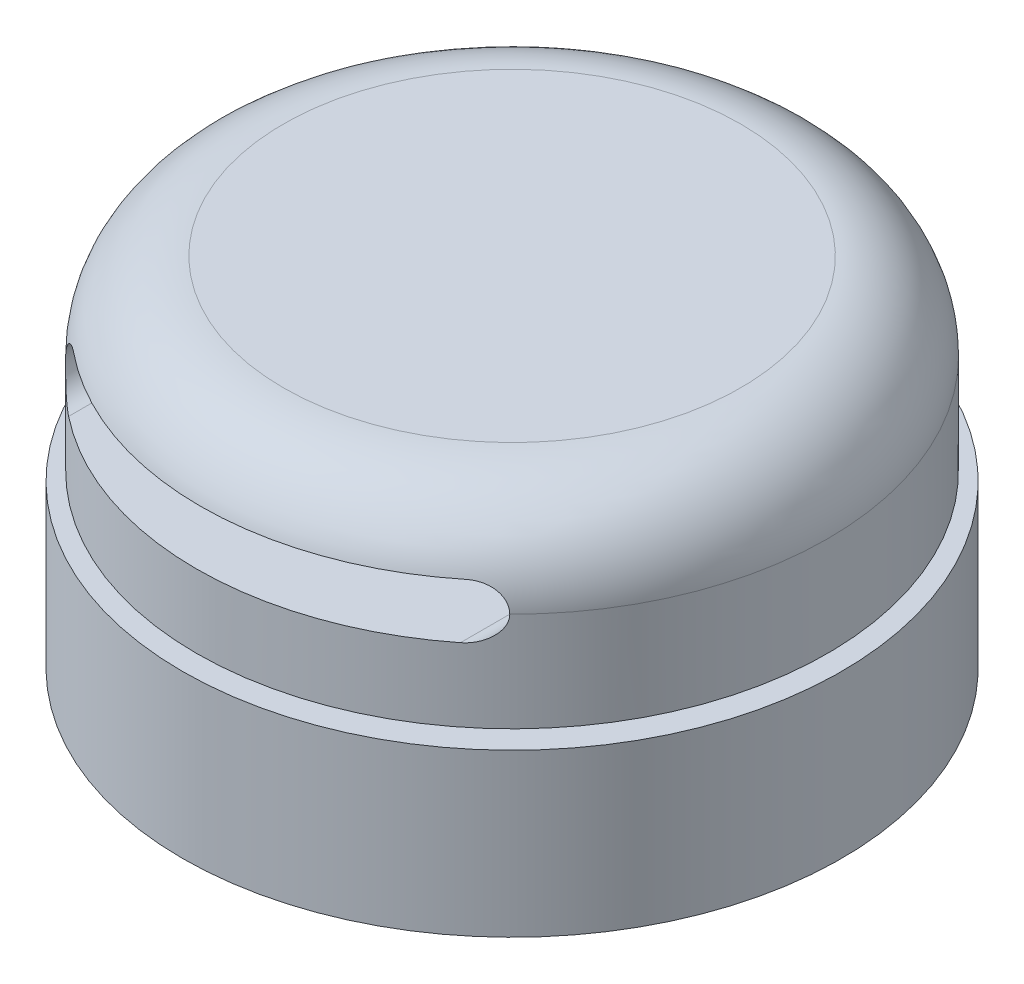
ISO-10303-21;
HEADER;
FILE_DESCRIPTION(('STEP AP214'),'2;1');
FILE_NAME('part.step','',(''),(''),'','','');
FILE_SCHEMA(('AUTOMOTIVE_DESIGN { 1 0 10303 214 1 1 1 1 }'));
ENDSEC;
DATA;
#1=APPLICATION_CONTEXT('core data for automotive mechanical design processes');
#2=APPLICATION_PROTOCOL_DEFINITION('international standard','automotive_design',2000,#1);
#3=PRODUCT_CONTEXT('',#1,'mechanical');
#4=PRODUCT('Part','Part','',(#3));
#5=PRODUCT_RELATED_PRODUCT_CATEGORY('part','',(#4));
#6=PRODUCT_DEFINITION_FORMATION('','',#4);
#7=PRODUCT_DEFINITION_CONTEXT('part definition',#1,'design');
#8=PRODUCT_DEFINITION('design','',#6,#7);
#9=PRODUCT_DEFINITION_SHAPE('','',#8);
#10=(LENGTH_UNIT() NAMED_UNIT(*) SI_UNIT(.MILLI.,.METRE.));
#11=(NAMED_UNIT(*) PLANE_ANGLE_UNIT() SI_UNIT($,.RADIAN.));
#12=(NAMED_UNIT(*) SI_UNIT($,.STERADIAN.) SOLID_ANGLE_UNIT());
#13=UNCERTAINTY_MEASURE_WITH_UNIT(LENGTH_MEASURE(1.E-05),#10,'distance_accuracy_value','');
#14=(GEOMETRIC_REPRESENTATION_CONTEXT(3) GLOBAL_UNCERTAINTY_ASSIGNED_CONTEXT((#13)) GLOBAL_UNIT_ASSIGNED_CONTEXT((#10,
#11,#12)) REPRESENTATION_CONTEXT('',''));
#15=CARTESIAN_POINT('',(0.,0.,0.));
#16=DIRECTION('',(0.,0.,1.));
#17=DIRECTION('',(1.,0.,0.));
#18=AXIS2_PLACEMENT_3D('',#15,#16,#17);
#19=CARTESIAN_POINT('',(0.,49.4448302035958,0.));
#20=DIRECTION('',(0.,1.,0.));
#21=DIRECTION('',(0.,0.,1.));
#22=AXIS2_PLACEMENT_3D('',#19,#20,#21);
#23=CYLINDRICAL_SURFACE('',#22,36.25);
#24=CARTESIAN_POINT('',(0.,19.6,0.));
#25=DIRECTION('',(0.,1.,0.));
#26=DIRECTION('',(0.,0.,1.));
#27=AXIS2_PLACEMENT_3D('',#24,#25,#26);
#28=CIRCLE('',#27,36.25);
#29=CARTESIAN_POINT('',(0.,19.6,36.25));
#30=VERTEX_POINT('',#29);
#31=EDGE_CURVE('E231',#30,#30,#28,.T.);
#32=ORIENTED_EDGE('',*,*,#31,.T.);
#33=EDGE_LOOP('',(#32));
#34=FACE_BOUND('',#33,.T.);
#35=CARTESIAN_POINT('',(0.,28.,0.));
#36=DIRECTION('',(0.,1.,0.));
#37=DIRECTION('',(-1.,0.,0.));
#38=AXIS2_PLACEMENT_3D('',#35,#36,#37);
#39=CIRCLE('',#38,36.25);
#40=CARTESIAN_POINT('',(22.5,28.,28.4220425022552));
#41=VERTEX_POINT('',#40);
#42=CARTESIAN_POINT('',(-22.5,28.,28.4220425022552));
#43=VERTEX_POINT('',#42);
#44=EDGE_CURVE('E11',#41,#43,#39,.F.);
#45=ORIENTED_EDGE('',*,*,#44,.T.);
#46=CARTESIAN_POINT('',(-22.5,28.,28.4220425022552));
#47=CARTESIAN_POINT('',(-22.5991272563362,28.0000112773811,28.3435762432978));
#48=CARTESIAN_POINT('',(-22.697827445781,28.0049132027138,28.2645912354259));
#49=CARTESIAN_POINT('',(-22.8938268930098,28.0243292954554,28.1060665100261));
#50=CARTESIAN_POINT('',(-22.9911261678836,28.0388433455037,28.0265267992827));
#51=CARTESIAN_POINT('',(-23.1846889628995,28.0774962676684,27.8666221445694));
#52=CARTESIAN_POINT('',(-23.2809340287388,28.1017247245251,27.7862564999019));
#53=CARTESIAN_POINT('',(-23.4709004230929,28.1597148240583,27.6259801937129));
#54=CARTESIAN_POINT('',(-23.5646216022771,28.1934770294658,27.5460695593325));
#55=CARTESIAN_POINT('',(-23.7574449798062,28.2740651726963,27.3799910318328));
#56=CARTESIAN_POINT('',(-23.8562543656633,28.3218040796117,27.2939200000065));
#57=CARTESIAN_POINT('',(-24.0493756344703,28.4286898186278,27.1239136057668));
#58=CARTESIAN_POINT('',(-24.1436863472653,28.4878395988589,27.0399788016296));
#59=CARTESIAN_POINT('',(-24.4179165026153,28.682320664838,26.7934214203328));
#60=CARTESIAN_POINT('',(-24.5901994018636,28.8351170492248,26.6351237337365));
#61=CARTESIAN_POINT('',(-24.8400139175762,29.1173885999269,26.4017593826387));
#62=CARTESIAN_POINT('',(-24.9277800711594,29.2315148636311,26.3188293455367));
#63=CARTESIAN_POINT('',(-25.0888665637583,29.4770938268026,26.1653116852357));
#64=CARTESIAN_POINT('',(-25.1622063713028,29.6085227704048,26.0947074429153));
#65=CARTESIAN_POINT('',(-25.2785290658651,29.8618145127486,25.981990342818));
#66=CARTESIAN_POINT('',(-25.324615937038,29.9809726603497,25.9370244790008));
#67=CARTESIAN_POINT('',(-25.4019013701025,30.2282175028122,25.861338833099));
#68=CARTESIAN_POINT('',(-25.4331323303266,30.3562840636697,25.83058805439));
#69=CARTESIAN_POINT('',(-25.4703815935338,30.5709626175445,25.7938479121685));
#70=CARTESIAN_POINT('',(-25.4814290604384,30.6558982250987,25.7829296057569));
#71=CARTESIAN_POINT('',(-25.4962634956304,30.8271956361515,25.7682572023124));
#72=CARTESIAN_POINT('',(-25.500034515711,30.9135601548995,25.7645188420633));
#73=CARTESIAN_POINT('',(-25.5,31.,25.764558990986));
#74=B_SPLINE_CURVE_WITH_KNOTS('',3,(#46,#47,#48,#49,#50,#51,#52,#53,#54,#55,#56,#57,#58,#59,#60,
#61,#62,#63,#64,#65,#66,#67,#68,#69,#70,#71,#72,#73),.UNSPECIFIED.,.F.,.F.,(4,2,2,2,2,2,2,2,2,2,
2,2,2,4),(0.,0.379158835135438,0.758313040962934,1.14104726612169,1.52380408695473,
1.94160001571141,2.35950403176349,3.19094804393893,3.68788832983314,4.18415331723883,
4.58891185558326,4.99278358764909,5.25124078062053,5.5102638084924),.UNSPECIFIED.);
#75=CARTESIAN_POINT('',(-25.5,31.,25.764558990986));
#76=VERTEX_POINT('',#75);
#77=EDGE_CURVE('E103',#43,#76,#74,.T.);
#78=ORIENTED_EDGE('',*,*,#77,.T.);
#79=CARTESIAN_POINT('',(0.,31.,0.));
#80=DIRECTION('',(0.,1.,0.));
#81=DIRECTION('',(0.,0.,1.));
#82=AXIS2_PLACEMENT_3D('',#79,#80,#81);
#83=CIRCLE('',#82,36.25);
#84=CARTESIAN_POINT('',(25.5,31.,25.764558990986));
#85=VERTEX_POINT('',#84);
#86=EDGE_CURVE('E236',#76,#85,#83,.F.);
#87=ORIENTED_EDGE('',*,*,#86,.T.);
#88=CARTESIAN_POINT('',(25.5,31.,25.764558990986));
#89=CARTESIAN_POINT('',(25.5000172713834,30.9318596471252,25.764539383198));
#90=CARTESIAN_POINT('',(25.4976790664596,30.8637337547345,25.766856042954));
#91=CARTESIAN_POINT('',(25.4884254085944,30.7281568662356,25.7760110725714));
#92=CARTESIAN_POINT('',(25.4815139236905,30.6607053364684,25.7828455225362));
#93=CARTESIAN_POINT('',(25.4633287036546,30.5276011333976,25.8008050837608));
#94=CARTESIAN_POINT('',(25.4520945502418,30.4619377652177,25.8118912599647));
#95=CARTESIAN_POINT('',(25.4254980141944,30.3322821351218,25.8380901036482));
#96=CARTESIAN_POINT('',(25.410134954237,30.2682901492777,25.853203431755));
#97=CARTESIAN_POINT('',(25.3583665023379,30.0798780468224,25.9040167571863));
#98=CARTESIAN_POINT('',(25.3162022237244,29.9584633816698,25.9452693626718));
#99=CARTESIAN_POINT('',(25.2189186269762,29.7258428632825,26.0398396648158));
#100=CARTESIAN_POINT('',(25.1637676843775,29.6146628671488,26.0931868014722));
#101=CARTESIAN_POINT('',(25.0171152840386,29.3586033689158,26.2339590258645));
#102=CARTESIAN_POINT('',(24.9201320793327,29.2195156501317,26.3262254428044));
#103=CARTESIAN_POINT('',(24.7100476611945,28.9645393883648,26.5235168401664));
#104=CARTESIAN_POINT('',(24.5969152011891,28.8486968921005,26.6285664948573));
#105=CARTESIAN_POINT('',(24.3206096512403,28.6064685409797,26.8815100554821));
#106=CARTESIAN_POINT('',(24.1529404535271,28.4883761275267,27.0324312218732));
#107=CARTESIAN_POINT('',(23.8026188944664,28.2900657730165,27.3414074125816));
#108=CARTESIAN_POINT('',(23.6199559788888,28.2098747841866,27.49946742619));
#109=CARTESIAN_POINT('',(23.2816293944573,28.0992960932102,27.7860971869189));
#110=CARTESIAN_POINT('',(23.1278140894917,28.062178052847,27.9142852426257));
#111=CARTESIAN_POINT('',(22.8941036352007,28.0249576716345,28.1057403630476));
#112=CARTESIAN_POINT('',(22.815843108061,28.0156272855841,28.1693093350365));
#113=CARTESIAN_POINT('',(22.6584839036153,28.0031509425896,28.2960391792622));
#114=CARTESIAN_POINT('',(22.5793850988749,28.0000059399043,28.3591999870311));
#115=CARTESIAN_POINT('',(22.5,28.,28.4220425022552));
#116=B_SPLINE_CURVE_WITH_KNOTS('',3,(#88,#89,#90,#91,#92,#93,#94,#95,#96,#97,#98,#99,#100,#101,
#102,#103,#104,#105,#106,#107,#108,#109,#110,#111,#112,#113,#114,#115),.UNSPECIFIED.,.F.,.F.,(4,
2,2,2,2,2,2,2,2,2,2,2,2,4),(0.,0.204318121551815,0.408459197149967,0.610773849385636,
0.813121710436548,1.21613155896967,1.62013313509266,2.19604903416862,2.77309474745016,
3.53301614365127,4.29347712043337,4.90281325968593,5.20641055033071,5.51005467521557),.UNSPECIFIED.);
#117=EDGE_CURVE('E105',#85,#41,#116,.T.);
#118=ORIENTED_EDGE('',*,*,#117,.T.);
#119=EDGE_LOOP('',(#45,#78,#87,#118));
#120=FACE_BOUND('',#119,.T.);
#121=ADVANCED_FACE('F39',(#34,#120),#23,.T.);
#122=CARTESIAN_POINT('',(0.,31.,0.));
#123=DIRECTION('',(0.,1.,0.));
#124=DIRECTION('',(0.,0.,1.));
#125=AXIS2_PLACEMENT_3D('',#122,#123,#124);
#126=TOROIDAL_SURFACE('',#125,26.25,10.);
#127=CARTESIAN_POINT('',(0.,41.,0.));
#128=DIRECTION('',(0.,1.,0.));
#129=DIRECTION('',(0.,0.,1.));
#130=AXIS2_PLACEMENT_3D('',#127,#128,#129);
#131=CIRCLE('',#130,26.25);
#132=CARTESIAN_POINT('',(0.,41.,26.25));
#133=VERTEX_POINT('',#132);
#134=EDGE_CURVE('E237',#133,#133,#131,.T.);
#135=ORIENTED_EDGE('',*,*,#134,.F.);
#136=EDGE_LOOP('',(#135));
#137=FACE_BOUND('',#136,.T.);
#138=ORIENTED_EDGE('',*,*,#86,.F.);
#139=CARTESIAN_POINT('',(-25.4999999933333,30.9998,25.7645589947703));
#140=CARTESIAN_POINT('',(-25.5000175110376,31.0755162061052,25.764553151556));
#141=CARTESIAN_POINT('',(-25.4971438987939,31.1512267279592,25.7661803309954));
#142=CARTESIAN_POINT('',(-25.4857092251534,31.3020596128595,25.7726768042864));
#143=CARTESIAN_POINT('',(-25.4771495092813,31.3771821107982,25.777545331126));
#144=CARTESIAN_POINT('',(-25.4544760193107,31.5260446816213,25.7904785352098));
#145=CARTESIAN_POINT('',(-25.4403812526578,31.5997885901689,25.7985322750519));
#146=CARTESIAN_POINT('',(-25.4068322496699,31.7456088450129,25.8177820040526));
#147=CARTESIAN_POINT('',(-25.3873778964153,31.8176851548934,25.828978061761));
#148=CARTESIAN_POINT('',(-25.3213253934495,32.0305982767729,25.8671860298296));
#149=CARTESIAN_POINT('',(-25.2670069476309,32.1683173580336,25.8988349788316));
#150=CARTESIAN_POINT('',(-25.1403773293489,32.4317202061442,25.9737424124763));
#151=CARTESIAN_POINT('',(-25.0680574807422,32.5573981289426,26.0170064960625));
#152=CARTESIAN_POINT('',(-24.9055089276521,32.798740258839,26.1160044664621));
#153=CARTESIAN_POINT('',(-24.8147106343673,32.9138526738924,26.1721449139143));
#154=CARTESIAN_POINT('',(-24.6206949419134,33.1268375386765,26.2945887823756));
#155=CARTESIAN_POINT('',(-24.5174736939047,33.2247046222539,26.3608953547726));
#156=CARTESIAN_POINT('',(-24.2893395339172,33.4130150464606,26.5106229773533));
#157=CARTESIAN_POINT('',(-24.1633042381564,33.5012199139916,26.5951402721566));
#158=CARTESIAN_POINT('',(-23.9041735911961,33.6553855422512,26.7731693077994));
#159=CARTESIAN_POINT('',(-23.7710724723956,33.7213277973182,26.8666884488012));
#160=CARTESIAN_POINT('',(-23.4778885212106,33.8412984770329,27.0775838543087));
#161=CARTESIAN_POINT('',(-23.3171202046934,33.8912944658442,27.1962890153816));
#162=CARTESIAN_POINT('',(-22.9948226561756,33.9635160282187,27.4404950363767));
#163=CARTESIAN_POINT('',(-22.8332940590861,33.9857616740381,27.5659909158314));
#164=CARTESIAN_POINT('',(-22.6150042948581,33.9983529712984,27.7395843902977));
#165=CARTESIAN_POINT('',(-22.5572955409082,34.0000008270953,27.7858615575676));
#166=CARTESIAN_POINT('',(-22.4998,33.9999999933335,27.8323477424015));
#167=B_SPLINE_CURVE_WITH_KNOTS('',3,(#139,#140,#141,#142,#143,#144,#145,#146,#147,#148,#149,
#150,#151,#152,#153,#154,#155,#156,#157,#158,#159,#160,#161,#162,#163,#164,#165,#166),
.UNSPECIFIED.,.F.,.F.,(4,2,2,2,2,2,2,2,2,2,2,2,2,4),(0.,0.227066296805612,0.454078881164673,
0.680318623755218,0.906563302166363,1.35845674785323,1.81056841596736,2.27962364438528,
2.74882456988933,3.27338767108217,3.79838574470446,4.41417458069823,5.0295177482654,
5.25139483674083),.UNSPECIFIED.);
#168=CARTESIAN_POINT('',(-22.5,34.,27.8321860575826));
#169=VERTEX_POINT('',#168);
#170=EDGE_CURVE('E48',#76,#169,#167,.T.);
#171=ORIENTED_EDGE('',*,*,#170,.T.);
#172=CARTESIAN_POINT('',(0.,34.,0.));
#173=DIRECTION('',(0.,-1.,0.));
#174=DIRECTION('',(1.,0.,0.));
#175=AXIS2_PLACEMENT_3D('',#172,#173,#174);
#176=CIRCLE('',#175,35.7893920141694);
#177=CARTESIAN_POINT('',(22.5,34.,27.8321860575826));
#178=VERTEX_POINT('',#177);
#179=EDGE_CURVE('E162',#169,#178,#176,.F.);
#180=ORIENTED_EDGE('',*,*,#179,.T.);
#181=CARTESIAN_POINT('',(22.4998,33.9999999933333,27.8323477424016));
#182=CARTESIAN_POINT('',(22.5984225716224,33.9999957188281,27.7526062788418));
#183=CARTESIAN_POINT('',(22.6976230091936,33.9951479508003,27.6735208497028));
#184=CARTESIAN_POINT('',(22.8966492154052,33.9753495674157,27.5171431554887));
#185=CARTESIAN_POINT('',(22.9964756712204,33.9603846383085,27.4398535916714));
#186=CARTESIAN_POINT('',(23.1965673752773,33.9198065640786,27.2872999160361));
#187=CARTESIAN_POINT('',(23.2968314339373,33.8941270332125,27.2120516023575));
#188=CARTESIAN_POINT('',(23.4961877205941,33.8316988732397,27.064810810761));
#189=CARTESIAN_POINT('',(23.5952806389214,33.7949571416169,26.9928163360934));
#190=CARTESIAN_POINT('',(23.8439066124515,33.6871627679986,26.8151306357611));
#191=CARTESIAN_POINT('',(23.9920192025216,33.6082740836184,26.7120518392895));
#192=CARTESIAN_POINT('',(24.277910226746,33.4223881034086,26.5180017968839));
#193=CARTESIAN_POINT('',(24.4157121397012,33.3154573324202,26.4270026536066));
#194=CARTESIAN_POINT('',(24.6106913524406,33.1337782800829,26.3011925445679));
#195=CARTESIAN_POINT('',(24.6740240571351,33.0692856724106,26.2608587311459));
#196=CARTESIAN_POINT('',(24.7956318145343,32.9334854181728,26.1842834765406));
#197=CARTESIAN_POINT('',(24.8539094601945,32.862181305435,26.1480399343757));
#198=CARTESIAN_POINT('',(24.9645292691856,32.7131016504713,26.0799565830624));
#199=CARTESIAN_POINT('',(25.0168692102681,32.6353237041023,26.0481184217009));
#200=CARTESIAN_POINT('',(25.1146818055152,32.4738858699209,25.9891648010046));
#201=CARTESIAN_POINT('',(25.1601560425117,32.390227344366,25.9620482529186));
#202=CARTESIAN_POINT('',(25.2374570525282,32.2300699490512,25.9163103062758));
#203=CARTESIAN_POINT('',(25.270305209565,32.1542503894408,25.8970289489764));
#204=CARTESIAN_POINT('',(25.3298549164385,31.9993992023459,25.8622677581169));
#205=CARTESIAN_POINT('',(25.3565575160765,31.9203681261796,25.8467872752506));
#206=CARTESIAN_POINT('',(25.4033680332189,31.7598871183957,25.8197640492955));
#207=CARTESIAN_POINT('',(25.4234882579191,31.6784420150475,25.8082139558369));
#208=CARTESIAN_POINT('',(25.4568777100031,31.5137392164621,25.7891003209302));
#209=CARTESIAN_POINT('',(25.4701509886044,31.430482623516,25.7815344220489));
#210=CARTESIAN_POINT('',(25.4865924902156,31.2891730829072,25.7721750445552));
#211=CARTESIAN_POINT('',(25.4916239529379,31.2313989030865,25.7693156024155));
#212=CARTESIAN_POINT('',(25.4983286577346,31.1156856912911,25.7655077068475));
#213=CARTESIAN_POINT('',(25.5000072252396,31.0577470673422,25.7645562229843));
#214=CARTESIAN_POINT('',(25.4999999933333,30.9998,25.7645589947703));
#215=B_SPLINE_CURVE_WITH_KNOTS('',3,(#181,#182,#183,#184,#185,#186,#187,#188,#189,#190,#191,
#192,#193,#194,#195,#196,#197,#198,#199,#200,#201,#202,#203,#204,#205,#206,#207,#208,#209,#210,
#211,#212,#213,#214),.UNSPECIFIED.,.F.,.F.,(4,2,2,2,2,2,2,2,2,2,2,2,2,2,2,2,4),(0.,
0.3804398097767,0.761418994979672,1.1447945588744,1.5279315744185,2.11634331995618,
2.70337159662863,2.99993807948059,3.29635152987902,3.5928755526654,3.88933110953184,
4.14352806694971,4.39768156944554,4.65135712360322,4.90488240973695,5.07895132697751,
5.25274354860004),.UNSPECIFIED.);
#216=EDGE_CURVE('E155',#178,#85,#215,.T.);
#217=ORIENTED_EDGE('',*,*,#216,.T.);
#218=EDGE_LOOP('',(#138,#171,#180,#217));
#219=FACE_BOUND('',#218,.T.);
#220=ADVANCED_FACE('F41',(#137,#219),#126,.T.);
#221=CARTESIAN_POINT('',(0.,0.,0.));
#222=DIRECTION('',(0.,-1.,0.));
#223=DIRECTION('',(0.,0.,-1.));
#224=AXIS2_PLACEMENT_3D('',#221,#222,#223);
#225=PLANE('',#224);
#226=CARTESIAN_POINT('',(20.8596500450028,0.,20.8596500450035));
#227=DIRECTION('',(0.,-1.,0.));
#228=DIRECTION('',(0.,0.,-1.));
#229=AXIS2_PLACEMENT_3D('',#226,#227,#228);
#230=CIRCLE('',#229,1.24999999999999);
#231=CARTESIAN_POINT('',(20.8596500450028,0.,19.6096500450035));
#232=VERTEX_POINT('',#231);
#233=EDGE_CURVE('E279',#232,#232,#230,.T.);
#234=ORIENTED_EDGE('',*,*,#233,.F.);
#235=EDGE_LOOP('',(#234));
#236=FACE_BOUND('',#235,.T.);
#237=CARTESIAN_POINT('',(20.8596500450033,0.,-20.859650045003));
#238=DIRECTION('',(0.,-1.,0.));
#239=DIRECTION('',(0.,0.,-1.));
#240=AXIS2_PLACEMENT_3D('',#237,#238,#239);
#241=CIRCLE('',#240,1.24999999999999);
#242=CARTESIAN_POINT('',(20.8596500450033,0.,-22.109650045003));
#243=VERTEX_POINT('',#242);
#244=EDGE_CURVE('E274',#243,#243,#241,.T.);
#245=ORIENTED_EDGE('',*,*,#244,.F.);
#246=EDGE_LOOP('',(#245));
#247=FACE_BOUND('',#246,.T.);
#248=CARTESIAN_POINT('',(-20.859650045003,0.,-20.8596500450033));
#249=DIRECTION('',(0.,-1.,0.));
#250=DIRECTION('',(0.,0.,-1.));
#251=AXIS2_PLACEMENT_3D('',#248,#249,#250);
#252=CIRCLE('',#251,1.24999999999999);
#253=CARTESIAN_POINT('',(-20.859650045003,0.,-22.1096500450033));
#254=VERTEX_POINT('',#253);
#255=EDGE_CURVE('E268',#254,#254,#252,.T.);
#256=ORIENTED_EDGE('',*,*,#255,.F.);
#257=EDGE_LOOP('',(#256));
#258=FACE_BOUND('',#257,.T.);
#259=CARTESIAN_POINT('',(-20.8596500450033,0.,20.859650045003));
#260=DIRECTION('',(0.,-1.,0.));
#261=DIRECTION('',(0.,0.,-1.));
#262=AXIS2_PLACEMENT_3D('',#259,#260,#261);
#263=CIRCLE('',#262,1.24999999999999);
#264=CARTESIAN_POINT('',(-20.8596500450033,0.,19.609650045003));
#265=VERTEX_POINT('',#264);
#266=EDGE_CURVE('E262',#265,#265,#263,.T.);
#267=ORIENTED_EDGE('',*,*,#266,.F.);
#268=EDGE_LOOP('',(#267));
#269=FACE_BOUND('',#268,.T.);
#270=CARTESIAN_POINT('',(0.,0.,29.5));
#271=DIRECTION('',(0.,-1.,0.));
#272=DIRECTION('',(0.,0.,-1.));
#273=AXIS2_PLACEMENT_3D('',#270,#271,#272);
#274=CIRCLE('',#273,1.5);
#275=CARTESIAN_POINT('',(0.,0.,28.));
#276=VERTEX_POINT('',#275);
#277=EDGE_CURVE('E254',#276,#276,#274,.T.);
#278=ORIENTED_EDGE('',*,*,#277,.F.);
#279=EDGE_LOOP('',(#278));
#280=FACE_BOUND('',#279,.T.);
#281=CARTESIAN_POINT('',(0.,0.,0.));
#282=DIRECTION('',(0.,1.,0.));
#283=DIRECTION('',(0.,0.,1.));
#284=AXIS2_PLACEMENT_3D('',#281,#282,#283);
#285=CIRCLE('',#284,37.845);
#286=CARTESIAN_POINT('',(0.,0.,37.845));
#287=VERTEX_POINT('',#286);
#288=EDGE_CURVE('E238',#287,#287,#285,.T.);
#289=ORIENTED_EDGE('',*,*,#288,.F.);
#290=EDGE_LOOP('',(#289));
#291=FACE_BOUND('',#290,.T.);
#292=ADVANCED_FACE('F226',(#236,#247,#258,#269,#280,#291),#225,.T.);
#293=CARTESIAN_POINT('',(0.,49.4448302035958,0.));
#294=DIRECTION('',(0.,1.,0.));
#295=DIRECTION('',(0.,0.,1.));
#296=AXIS2_PLACEMENT_3D('',#293,#294,#295);
#297=CYLINDRICAL_SURFACE('',#296,37.845);
#298=ORIENTED_EDGE('',*,*,#288,.T.);
#299=EDGE_LOOP('',(#298));
#300=FACE_BOUND('',#299,.T.);
#301=CARTESIAN_POINT('',(0.,18.6,0.));
#302=DIRECTION('',(0.,1.,0.));
#303=DIRECTION('',(0.,0.,1.));
#304=AXIS2_PLACEMENT_3D('',#301,#302,#303);
#305=CIRCLE('',#304,37.845);
#306=CARTESIAN_POINT('',(0.,18.6,37.845));
#307=VERTEX_POINT('',#306);
#308=EDGE_CURVE('E243',#307,#307,#305,.T.);
#309=ORIENTED_EDGE('',*,*,#308,.F.);
#310=EDGE_LOOP('',(#309));
#311=FACE_BOUND('',#310,.T.);
#312=ADVANCED_FACE('F286',(#300,#311),#297,.T.);
#313=CARTESIAN_POINT('',(-37.845,18.6,0.));
#314=DIRECTION('',(0.,1.,0.));
#315=DIRECTION('',(0.,0.,1.));
#316=AXIS2_PLACEMENT_3D('',#313,#314,#315);
#317=PLANE('',#316);
#318=ORIENTED_EDGE('',*,*,#308,.T.);
#319=EDGE_LOOP('',(#318));
#320=FACE_BOUND('',#319,.T.);
#321=CARTESIAN_POINT('',(0.,18.6,0.));
#322=DIRECTION('',(0.,1.,0.));
#323=DIRECTION('',(0.,0.,1.));
#324=AXIS2_PLACEMENT_3D('',#321,#322,#323);
#325=CIRCLE('',#324,34.);
#326=CARTESIAN_POINT('',(0.,18.6,34.));
#327=VERTEX_POINT('',#326);
#328=EDGE_CURVE('E246',#327,#327,#325,.T.);
#329=ORIENTED_EDGE('',*,*,#328,.F.);
#330=EDGE_LOOP('',(#329));
#331=FACE_BOUND('',#330,.T.);
#332=ADVANCED_FACE('F299',(#320,#331),#317,.T.);
#333=CARTESIAN_POINT('',(0.,49.4448302035958,0.));
#334=DIRECTION('',(0.,1.,0.));
#335=DIRECTION('',(0.,0.,1.));
#336=AXIS2_PLACEMENT_3D('',#333,#334,#335);
#337=CYLINDRICAL_SURFACE('',#336,34.);
#338=ORIENTED_EDGE('',*,*,#328,.T.);
#339=EDGE_LOOP('',(#338));
#340=FACE_BOUND('',#339,.T.);
#341=CARTESIAN_POINT('',(0.,19.6,0.));
#342=DIRECTION('',(0.,1.,0.));
#343=DIRECTION('',(0.,0.,1.));
#344=AXIS2_PLACEMENT_3D('',#341,#342,#343);
#345=CIRCLE('',#344,34.);
#346=CARTESIAN_POINT('',(0.,19.6,34.));
#347=VERTEX_POINT('',#346);
#348=EDGE_CURVE('E249',#347,#347,#345,.T.);
#349=ORIENTED_EDGE('',*,*,#348,.F.);
#350=EDGE_LOOP('',(#349));
#351=FACE_BOUND('',#350,.T.);
#352=ADVANCED_FACE('F218',(#340,#351),#337,.T.);
#353=CARTESIAN_POINT('',(-34.,19.6,0.));
#354=DIRECTION('',(0.,-1.,0.));
#355=DIRECTION('',(0.,0.,-1.));
#356=AXIS2_PLACEMENT_3D('',#353,#354,#355);
#357=PLANE('',#356);
#358=ORIENTED_EDGE('',*,*,#348,.T.);
#359=EDGE_LOOP('',(#358));
#360=FACE_BOUND('',#359,.T.);
#361=ORIENTED_EDGE('',*,*,#31,.F.);
#362=EDGE_LOOP('',(#361));
#363=FACE_BOUND('',#362,.T.);
#364=ADVANCED_FACE('F213',(#360,#363),#357,.T.);
#365=CARTESIAN_POINT('',(-36.25,41.,0.));
#366=DIRECTION('',(0.,1.,0.));
#367=DIRECTION('',(0.,0.,1.));
#368=AXIS2_PLACEMENT_3D('',#365,#366,#367);
#369=PLANE('',#368);
#370=ORIENTED_EDGE('',*,*,#134,.T.);
#371=EDGE_LOOP('',(#370));
#372=FACE_BOUND('',#371,.T.);
#373=ADVANCED_FACE('F210',(#372),#369,.T.);
#374=CARTESIAN_POINT('',(0.,1.,29.5));
#375=DIRECTION('',(0.,-1.,0.));
#376=DIRECTION('',(0.,0.,-1.));
#377=AXIS2_PLACEMENT_3D('',#374,#375,#376);
#378=CYLINDRICAL_SURFACE('',#377,1.5);
#379=CARTESIAN_POINT('',(0.,1.,29.5));
#380=DIRECTION('',(0.,-1.,0.));
#381=DIRECTION('',(0.,0.,-1.));
#382=AXIS2_PLACEMENT_3D('',#379,#380,#381);
#383=CIRCLE('',#382,1.5);
#384=CARTESIAN_POINT('',(0.,1.,28.));
#385=VERTEX_POINT('',#384);
#386=EDGE_CURVE('E253',#385,#385,#383,.T.);
#387=ORIENTED_EDGE('',*,*,#386,.F.);
#388=EDGE_LOOP('',(#387));
#389=FACE_BOUND('',#388,.T.);
#390=ORIENTED_EDGE('',*,*,#277,.T.);
#391=EDGE_LOOP('',(#390));
#392=FACE_BOUND('',#391,.T.);
#393=ADVANCED_FACE('F207',(#389,#392),#378,.F.);
#394=CARTESIAN_POINT('',(0.,1.,29.5));
#395=DIRECTION('',(0.,-1.,0.));
#396=DIRECTION('',(0.,0.,-1.));
#397=AXIS2_PLACEMENT_3D('',#394,#395,#396);
#398=PLANE('',#397);
#399=ORIENTED_EDGE('',*,*,#386,.T.);
#400=EDGE_LOOP('',(#399));
#401=FACE_BOUND('',#400,.T.);
#402=ADVANCED_FACE('F204',(#401),#398,.T.);
#403=CARTESIAN_POINT('',(-20.8596500450033,7.50000000000001,20.859650045003));
#404=DIRECTION('',(0.,-1.,0.));
#405=DIRECTION('',(0.,0.,-1.));
#406=AXIS2_PLACEMENT_3D('',#403,#404,#405);
#407=CONICAL_SURFACE('',#406,1.24999999999999,1.02974425867665);
#408=CARTESIAN_POINT('',(-20.8596500450033,8.25107577378445,20.859650045003));
#409=VERTEX_POINT('',#408);
#410=VERTEX_LOOP('',#409);
#411=FACE_BOUND('',#410,.T.);
#412=CARTESIAN_POINT('',(-20.8596500450033,7.50000000000001,20.859650045003));
#413=DIRECTION('',(0.,-1.,0.));
#414=DIRECTION('',(0.,0.,-1.));
#415=AXIS2_PLACEMENT_3D('',#412,#413,#414);
#416=CIRCLE('',#415,1.24999999999999);
#417=CARTESIAN_POINT('',(-20.8596500450033,7.50000000000001,19.609650045003));
#418=VERTEX_POINT('',#417);
#419=EDGE_CURVE('E257',#418,#418,#416,.T.);
#420=ORIENTED_EDGE('',*,*,#419,.T.);
#421=EDGE_LOOP('',(#420));
#422=FACE_BOUND('',#421,.T.);
#423=ADVANCED_FACE('F200',(#411,#422),#407,.F.);
#424=CARTESIAN_POINT('',(-20.8596500450033,0.,20.859650045003));
#425=DIRECTION('',(0.,-1.,0.));
#426=DIRECTION('',(0.,0.,-1.));
#427=AXIS2_PLACEMENT_3D('',#424,#425,#426);
#428=CYLINDRICAL_SURFACE('',#427,1.24999999999999);
#429=ORIENTED_EDGE('',*,*,#419,.F.);
#430=EDGE_LOOP('',(#429));
#431=FACE_BOUND('',#430,.T.);
#432=ORIENTED_EDGE('',*,*,#266,.T.);
#433=EDGE_LOOP('',(#432));
#434=FACE_BOUND('',#433,.T.);
#435=ADVANCED_FACE('F196',(#431,#434),#428,.F.);
#436=CARTESIAN_POINT('',(-20.859650045003,7.50000000000001,-20.8596500450033));
#437=DIRECTION('',(0.,-1.,0.));
#438=DIRECTION('',(0.,0.,-1.));
#439=AXIS2_PLACEMENT_3D('',#436,#437,#438);
#440=CONICAL_SURFACE('',#439,1.24999999999999,1.02974425867665);
#441=CARTESIAN_POINT('',(-20.859650045003,8.25107577378445,-20.8596500450033));
#442=VERTEX_POINT('',#441);
#443=VERTEX_LOOP('',#442);
#444=FACE_BOUND('',#443,.T.);
#445=CARTESIAN_POINT('',(-20.859650045003,7.50000000000001,-20.8596500450033));
#446=DIRECTION('',(0.,-1.,0.));
#447=DIRECTION('',(0.,0.,-1.));
#448=AXIS2_PLACEMENT_3D('',#445,#446,#447);
#449=CIRCLE('',#448,1.24999999999999);
#450=CARTESIAN_POINT('',(-20.859650045003,7.50000000000001,-22.1096500450033));
#451=VERTEX_POINT('',#450);
#452=EDGE_CURVE('E265',#451,#451,#449,.T.);
#453=ORIENTED_EDGE('',*,*,#452,.T.);
#454=EDGE_LOOP('',(#453));
#455=FACE_BOUND('',#454,.T.);
#456=ADVANCED_FACE('F192',(#444,#455),#440,.F.);
#457=CARTESIAN_POINT('',(-20.859650045003,0.,-20.8596500450033));
#458=DIRECTION('',(0.,-1.,0.));
#459=DIRECTION('',(0.,0.,-1.));
#460=AXIS2_PLACEMENT_3D('',#457,#458,#459);
#461=CYLINDRICAL_SURFACE('',#460,1.24999999999999);
#462=ORIENTED_EDGE('',*,*,#452,.F.);
#463=EDGE_LOOP('',(#462));
#464=FACE_BOUND('',#463,.T.);
#465=ORIENTED_EDGE('',*,*,#255,.T.);
#466=EDGE_LOOP('',(#465));
#467=FACE_BOUND('',#466,.T.);
#468=ADVANCED_FACE('F188',(#464,#467),#461,.F.);
#469=CARTESIAN_POINT('',(20.8596500450033,7.50000000000001,-20.859650045003));
#470=DIRECTION('',(0.,-1.,0.));
#471=DIRECTION('',(0.,0.,-1.));
#472=AXIS2_PLACEMENT_3D('',#469,#470,#471);
#473=CONICAL_SURFACE('',#472,1.24999999999999,1.02974425867665);
#474=CARTESIAN_POINT('',(20.8596500450033,8.25107577378445,-20.859650045003));
#475=VERTEX_POINT('',#474);
#476=VERTEX_LOOP('',#475);
#477=FACE_BOUND('',#476,.T.);
#478=CARTESIAN_POINT('',(20.8596500450033,7.50000000000001,-20.859650045003));
#479=DIRECTION('',(0.,-1.,0.));
#480=DIRECTION('',(0.,0.,-1.));
#481=AXIS2_PLACEMENT_3D('',#478,#479,#480);
#482=CIRCLE('',#481,1.24999999999999);
#483=CARTESIAN_POINT('',(20.8596500450033,7.50000000000001,-22.109650045003));
#484=VERTEX_POINT('',#483);
#485=EDGE_CURVE('E271',#484,#484,#482,.T.);
#486=ORIENTED_EDGE('',*,*,#485,.T.);
#487=EDGE_LOOP('',(#486));
#488=FACE_BOUND('',#487,.T.);
#489=ADVANCED_FACE('F184',(#477,#488),#473,.F.);
#490=CARTESIAN_POINT('',(20.8596500450033,0.,-20.859650045003));
#491=DIRECTION('',(0.,-1.,0.));
#492=DIRECTION('',(0.,0.,-1.));
#493=AXIS2_PLACEMENT_3D('',#490,#491,#492);
#494=CYLINDRICAL_SURFACE('',#493,1.24999999999999);
#495=ORIENTED_EDGE('',*,*,#485,.F.);
#496=EDGE_LOOP('',(#495));
#497=FACE_BOUND('',#496,.T.);
#498=ORIENTED_EDGE('',*,*,#244,.T.);
#499=EDGE_LOOP('',(#498));
#500=FACE_BOUND('',#499,.T.);
#501=ADVANCED_FACE('F180',(#497,#500),#494,.F.);
#502=CARTESIAN_POINT('',(20.8596500450028,7.50000000000001,20.8596500450035));
#503=DIRECTION('',(0.,-1.,0.));
#504=DIRECTION('',(0.,0.,-1.));
#505=AXIS2_PLACEMENT_3D('',#502,#503,#504);
#506=CONICAL_SURFACE('',#505,1.24999999999999,1.02974425867665);
#507=CARTESIAN_POINT('',(20.8596500450028,8.25107577378445,20.8596500450035));
#508=VERTEX_POINT('',#507);
#509=VERTEX_LOOP('',#508);
#510=FACE_BOUND('',#509,.T.);
#511=CARTESIAN_POINT('',(20.8596500450028,7.50000000000001,20.8596500450035));
#512=DIRECTION('',(0.,-1.,0.));
#513=DIRECTION('',(0.,0.,-1.));
#514=AXIS2_PLACEMENT_3D('',#511,#512,#513);
#515=CIRCLE('',#514,1.24999999999999);
#516=CARTESIAN_POINT('',(20.8596500450028,7.50000000000001,19.6096500450035));
#517=VERTEX_POINT('',#516);
#518=EDGE_CURVE('E277',#517,#517,#515,.T.);
#519=ORIENTED_EDGE('',*,*,#518,.T.);
#520=EDGE_LOOP('',(#519));
#521=FACE_BOUND('',#520,.T.);
#522=ADVANCED_FACE('F176',(#510,#521),#506,.F.);
#523=CARTESIAN_POINT('',(20.8596500450028,0.,20.8596500450035));
#524=DIRECTION('',(0.,-1.,0.));
#525=DIRECTION('',(0.,0.,-1.));
#526=AXIS2_PLACEMENT_3D('',#523,#524,#525);
#527=CYLINDRICAL_SURFACE('',#526,1.24999999999999);
#528=ORIENTED_EDGE('',*,*,#518,.F.);
#529=EDGE_LOOP('',(#528));
#530=FACE_BOUND('',#529,.T.);
#531=ORIENTED_EDGE('',*,*,#233,.T.);
#532=EDGE_LOOP('',(#531));
#533=FACE_BOUND('',#532,.T.);
#534=ADVANCED_FACE('F172',(#530,#533),#527,.F.);
#535=CARTESIAN_POINT('',(-22.5,31.,37.845));
#536=DIRECTION('',(0.,0.,-1.));
#537=DIRECTION('',(-1.,0.,0.));
#538=AXIS2_PLACEMENT_3D('',#535,#536,#537);
#539=CYLINDRICAL_SURFACE('',#538,3.00000000000001);
#540=DIRECTION('',(0.,0.,-1.));
#541=VECTOR('',#540,1.);
#542=CARTESIAN_POINT('',(-22.5,28.,37.845));
#543=LINE('',#542,#541);
#544=CARTESIAN_POINT('',(-22.5,28.,0.));
#545=VERTEX_POINT('',#544);
#546=EDGE_CURVE('E96',#43,#545,#543,.T.);
#547=ORIENTED_EDGE('',*,*,#546,.T.);
#548=CARTESIAN_POINT('',(-22.5,31.,0.));
#549=DIRECTION('',(0.,0.,1.));
#550=DIRECTION('',(1.,0.,0.));
#551=AXIS2_PLACEMENT_3D('',#548,#549,#550);
#552=CIRCLE('',#551,3.00000000000001);
#553=CARTESIAN_POINT('',(-22.5,34.,0.));
#554=VERTEX_POINT('',#553);
#555=EDGE_CURVE('E101',#554,#545,#552,.T.);
#556=ORIENTED_EDGE('',*,*,#555,.F.);
#557=DIRECTION('',(0.,0.,-1.));
#558=VECTOR('',#557,1.);
#559=CARTESIAN_POINT('',(-22.5,34.,37.845));
#560=LINE('',#559,#558);
#561=EDGE_CURVE('E124',#169,#554,#560,.T.);
#562=ORIENTED_EDGE('',*,*,#561,.F.);
#563=ORIENTED_EDGE('',*,*,#170,.F.);
#564=ORIENTED_EDGE('',*,*,#77,.F.);
#565=EDGE_LOOP('',(#547,#556,#562,#563,#564));
#566=FACE_BOUND('',#565,.T.);
#567=ADVANCED_FACE('F98',(#566),#539,.F.);
#568=CARTESIAN_POINT('',(-22.5,28.,37.845));
#569=DIRECTION('',(0.,1.,0.));
#570=DIRECTION('',(-1.,0.,0.));
#571=AXIS2_PLACEMENT_3D('',#568,#569,#570);
#572=PLANE('',#571);
#573=DIRECTION('',(0.,0.,-1.));
#574=VECTOR('',#573,1.);
#575=CARTESIAN_POINT('',(22.5,28.,37.845));
#576=LINE('',#575,#574);
#577=CARTESIAN_POINT('',(22.5,28.,0.));
#578=VERTEX_POINT('',#577);
#579=EDGE_CURVE('E106',#41,#578,#576,.T.);
#580=ORIENTED_EDGE('',*,*,#579,.T.);
#581=DIRECTION('',(1.,0.,0.));
#582=VECTOR('',#581,1.);
#583=CARTESIAN_POINT('',(-22.5,28.,0.));
#584=LINE('',#583,#582);
#585=EDGE_CURVE('E109',#545,#578,#584,.T.);
#586=ORIENTED_EDGE('',*,*,#585,.F.);
#587=ORIENTED_EDGE('',*,*,#546,.F.);
#588=ORIENTED_EDGE('',*,*,#44,.F.);
#589=EDGE_LOOP('',(#580,#586,#587,#588));
#590=FACE_BOUND('',#589,.T.);
#591=ADVANCED_FACE('F110',(#590),#572,.T.);
#592=CARTESIAN_POINT('',(22.5,31.,37.845));
#593=DIRECTION('',(0.,0.,-1.));
#594=DIRECTION('',(-1.,0.,0.));
#595=AXIS2_PLACEMENT_3D('',#592,#593,#594);
#596=CYLINDRICAL_SURFACE('',#595,3.00000000000001);
#597=ORIENTED_EDGE('',*,*,#216,.F.);
#598=DIRECTION('',(0.,0.,-1.));
#599=VECTOR('',#598,1.);
#600=CARTESIAN_POINT('',(22.5,34.,37.845));
#601=LINE('',#600,#599);
#602=CARTESIAN_POINT('',(22.5,34.,0.));
#603=VERTEX_POINT('',#602);
#604=EDGE_CURVE('E55',#178,#603,#601,.T.);
#605=ORIENTED_EDGE('',*,*,#604,.T.);
#606=CARTESIAN_POINT('',(22.5,31.,0.));
#607=DIRECTION('',(0.,0.,1.));
#608=DIRECTION('',(1.,0.,0.));
#609=AXIS2_PLACEMENT_3D('',#606,#607,#608);
#610=CIRCLE('',#609,3.00000000000001);
#611=EDGE_CURVE('E115',#578,#603,#610,.T.);
#612=ORIENTED_EDGE('',*,*,#611,.F.);
#613=ORIENTED_EDGE('',*,*,#579,.F.);
#614=ORIENTED_EDGE('',*,*,#117,.F.);
#615=EDGE_LOOP('',(#597,#605,#612,#613,#614));
#616=FACE_BOUND('',#615,.T.);
#617=ADVANCED_FACE('F145',(#616),#596,.F.);
#618=CARTESIAN_POINT('',(-22.5,34.,37.845));
#619=DIRECTION('',(0.,-1.,0.));
#620=DIRECTION('',(1.,0.,0.));
#621=AXIS2_PLACEMENT_3D('',#618,#619,#620);
#622=PLANE('',#621);
#623=ORIENTED_EDGE('',*,*,#561,.T.);
#624=DIRECTION('',(-1.,0.,0.));
#625=VECTOR('',#624,1.);
#626=CARTESIAN_POINT('',(-22.5,34.,0.));
#627=LINE('',#626,#625);
#628=EDGE_CURVE('E119',#603,#554,#627,.T.);
#629=ORIENTED_EDGE('',*,*,#628,.F.);
#630=ORIENTED_EDGE('',*,*,#604,.F.);
#631=ORIENTED_EDGE('',*,*,#179,.F.);
#632=EDGE_LOOP('',(#623,#629,#630,#631));
#633=FACE_BOUND('',#632,.T.);
#634=ADVANCED_FACE('F150',(#633),#622,.T.);
#635=CARTESIAN_POINT('',(-22.5,31.,0.));
#636=DIRECTION('',(0.,0.,1.));
#637=DIRECTION('',(1.,0.,0.));
#638=AXIS2_PLACEMENT_3D('',#635,#636,#637);
#639=PLANE('',#638);
#640=ORIENTED_EDGE('',*,*,#555,.T.);
#641=ORIENTED_EDGE('',*,*,#585,.T.);
#642=ORIENTED_EDGE('',*,*,#611,.T.);
#643=ORIENTED_EDGE('',*,*,#628,.T.);
#644=EDGE_LOOP('',(#640,#641,#642,#643));
#645=FACE_BOUND('',#644,.T.);
#646=ADVANCED_FACE('F118',(#645),#639,.T.);
#647=CLOSED_SHELL('',(#121,#220,#292,#312,#332,#352,#364,#373,#393,#402,#423,#435,#456,#468,
#489,#501,#522,#534,#567,#591,#617,#634,#646));
#648=MANIFOLD_SOLID_BREP('B2',#647);
#649=ADVANCED_BREP_SHAPE_REPRESENTATION('',(#18,#648),#14);
#650=SHAPE_DEFINITION_REPRESENTATION(#9,#649);
ENDSEC;
END-ISO-10303-21;
